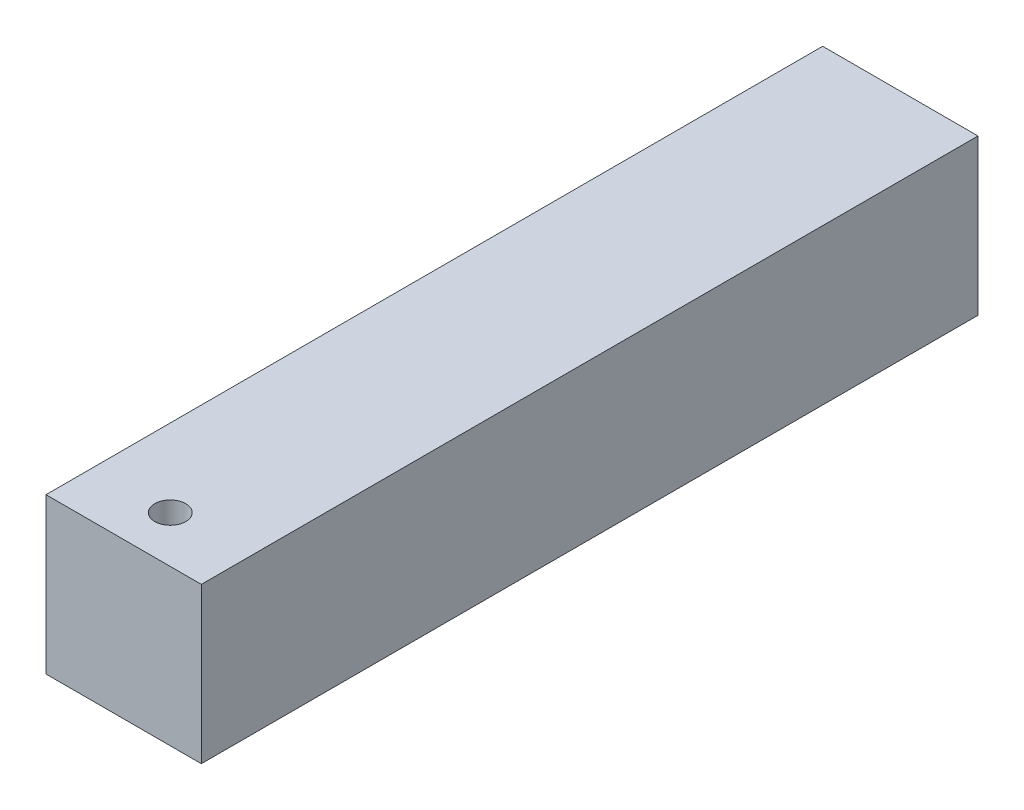
ISO-10303-21;
HEADER;
FILE_DESCRIPTION(('STEP AP214'),'2;1');
FILE_NAME('part.step','',(''),(''),'','','');
FILE_SCHEMA(('AUTOMOTIVE_DESIGN { 1 0 10303 214 1 1 1 1 }'));
ENDSEC;
DATA;
#1=APPLICATION_CONTEXT('core data for automotive mechanical design processes');
#2=APPLICATION_PROTOCOL_DEFINITION('international standard','automotive_design',2000,#1);
#3=PRODUCT_CONTEXT('',#1,'mechanical');
#4=PRODUCT('Part','Part','',(#3));
#5=PRODUCT_RELATED_PRODUCT_CATEGORY('part','',(#4));
#6=PRODUCT_DEFINITION_FORMATION('','',#4);
#7=PRODUCT_DEFINITION_CONTEXT('part definition',#1,'design');
#8=PRODUCT_DEFINITION('design','',#6,#7);
#9=PRODUCT_DEFINITION_SHAPE('','',#8);
#10=(LENGTH_UNIT() NAMED_UNIT(*) SI_UNIT(.MILLI.,.METRE.));
#11=(NAMED_UNIT(*) PLANE_ANGLE_UNIT() SI_UNIT($,.RADIAN.));
#12=(NAMED_UNIT(*) SI_UNIT($,.STERADIAN.) SOLID_ANGLE_UNIT());
#13=UNCERTAINTY_MEASURE_WITH_UNIT(LENGTH_MEASURE(1.E-05),#10,'distance_accuracy_value','');
#14=(GEOMETRIC_REPRESENTATION_CONTEXT(3) GLOBAL_UNCERTAINTY_ASSIGNED_CONTEXT((#13)) GLOBAL_UNIT_ASSIGNED_CONTEXT((#10,
#11,#12)) REPRESENTATION_CONTEXT('',''));
#15=CARTESIAN_POINT('',(0.,0.,0.));
#16=DIRECTION('',(0.,0.,1.));
#17=DIRECTION('',(1.,0.,0.));
#18=AXIS2_PLACEMENT_3D('',#15,#16,#17);
#19=CARTESIAN_POINT('',(0.,0.,50.));
#20=DIRECTION('',(1.,0.,0.));
#21=DIRECTION('',(0.,1.,0.));
#22=AXIS2_PLACEMENT_3D('',#19,#20,#21);
#23=PLANE('',#22);
#24=DIRECTION('',(0.,-1.,0.));
#25=VECTOR('',#24,1.);
#26=CARTESIAN_POINT('',(0.,0.,0.));
#27=LINE('',#26,#25);
#28=CARTESIAN_POINT('',(0.,0.,0.));
#29=VERTEX_POINT('',#28);
#30=CARTESIAN_POINT('',(0.,-10.,0.));
#31=VERTEX_POINT('',#30);
#32=EDGE_CURVE('E109',#29,#31,#27,.T.);
#33=ORIENTED_EDGE('',*,*,#32,.T.);
#34=DIRECTION('',(0.,0.,-1.));
#35=VECTOR('',#34,1.);
#36=CARTESIAN_POINT('',(0.,-10.,50.));
#37=LINE('',#36,#35);
#38=CARTESIAN_POINT('',(0.,-10.,50.));
#39=VERTEX_POINT('',#38);
#40=EDGE_CURVE('E11',#39,#31,#37,.T.);
#41=ORIENTED_EDGE('',*,*,#40,.F.);
#42=DIRECTION('',(0.,-1.,0.));
#43=VECTOR('',#42,1.);
#44=CARTESIAN_POINT('',(0.,0.,50.));
#45=LINE('',#44,#43);
#46=CARTESIAN_POINT('',(0.,0.,50.));
#47=VERTEX_POINT('',#46);
#48=EDGE_CURVE('E92',#47,#39,#45,.T.);
#49=ORIENTED_EDGE('',*,*,#48,.F.);
#50=DIRECTION('',(0.,0.,-1.));
#51=VECTOR('',#50,1.);
#52=CARTESIAN_POINT('',(0.,0.,50.));
#53=LINE('',#52,#51);
#54=EDGE_CURVE('E105',#47,#29,#53,.T.);
#55=ORIENTED_EDGE('',*,*,#54,.T.);
#56=EDGE_LOOP('',(#33,#41,#49,#55));
#57=FACE_BOUND('',#56,.T.);
#58=ADVANCED_FACE('F39',(#57),#23,.F.);
#59=CARTESIAN_POINT('',(0.,-10.,50.));
#60=DIRECTION('',(0.,1.,0.));
#61=DIRECTION('',(0.,0.,1.));
#62=AXIS2_PLACEMENT_3D('',#59,#60,#61);
#63=PLANE('',#62);
#64=CARTESIAN_POINT('',(5.,-10.,47.));
#65=DIRECTION('',(0.,-1.,0.));
#66=DIRECTION('',(0.,0.,-1.));
#67=AXIS2_PLACEMENT_3D('',#64,#65,#66);
#68=CIRCLE('',#67,1.);
#69=CARTESIAN_POINT('',(5.,-10.,46.));
#70=VERTEX_POINT('',#69);
#71=EDGE_CURVE('E129',#70,#70,#68,.T.);
#72=ORIENTED_EDGE('',*,*,#71,.F.);
#73=EDGE_LOOP('',(#72));
#74=FACE_BOUND('',#73,.T.);
#75=DIRECTION('',(1.,0.,0.));
#76=VECTOR('',#75,1.);
#77=CARTESIAN_POINT('',(0.,-10.,0.));
#78=LINE('',#77,#76);
#79=CARTESIAN_POINT('',(10.,-10.,0.));
#80=VERTEX_POINT('',#79);
#81=EDGE_CURVE('E97',#31,#80,#78,.T.);
#82=ORIENTED_EDGE('',*,*,#81,.T.);
#83=DIRECTION('',(0.,0.,-1.));
#84=VECTOR('',#83,1.);
#85=CARTESIAN_POINT('',(10.,-10.,50.));
#86=LINE('',#85,#84);
#87=CARTESIAN_POINT('',(10.,-10.,50.));
#88=VERTEX_POINT('',#87);
#89=EDGE_CURVE('E49',#88,#80,#86,.T.);
#90=ORIENTED_EDGE('',*,*,#89,.F.);
#91=DIRECTION('',(1.,0.,0.));
#92=VECTOR('',#91,1.);
#93=CARTESIAN_POINT('',(0.,-10.,50.));
#94=LINE('',#93,#92);
#95=EDGE_CURVE('E87',#39,#88,#94,.T.);
#96=ORIENTED_EDGE('',*,*,#95,.F.);
#97=ORIENTED_EDGE('',*,*,#40,.T.);
#98=EDGE_LOOP('',(#82,#90,#96,#97));
#99=FACE_BOUND('',#98,.T.);
#100=ADVANCED_FACE('F96',(#74,#99),#63,.F.);
#101=CARTESIAN_POINT('',(10.,0.,50.));
#102=DIRECTION('',(-1.,0.,0.));
#103=DIRECTION('',(0.,-1.,0.));
#104=AXIS2_PLACEMENT_3D('',#101,#102,#103);
#105=PLANE('',#104);
#106=DIRECTION('',(0.,1.,0.));
#107=VECTOR('',#106,1.);
#108=CARTESIAN_POINT('',(10.,0.,0.));
#109=LINE('',#108,#107);
#110=CARTESIAN_POINT('',(10.,0.,0.));
#111=VERTEX_POINT('',#110);
#112=EDGE_CURVE('E74',#80,#111,#109,.T.);
#113=ORIENTED_EDGE('',*,*,#112,.T.);
#114=DIRECTION('',(0.,0.,-1.));
#115=VECTOR('',#114,1.);
#116=CARTESIAN_POINT('',(10.,0.,50.));
#117=LINE('',#116,#115);
#118=CARTESIAN_POINT('',(10.,0.,50.));
#119=VERTEX_POINT('',#118);
#120=EDGE_CURVE('E99',#119,#111,#117,.T.);
#121=ORIENTED_EDGE('',*,*,#120,.F.);
#122=DIRECTION('',(0.,1.,0.));
#123=VECTOR('',#122,1.);
#124=CARTESIAN_POINT('',(10.,0.,50.));
#125=LINE('',#124,#123);
#126=EDGE_CURVE('E90',#88,#119,#125,.T.);
#127=ORIENTED_EDGE('',*,*,#126,.F.);
#128=ORIENTED_EDGE('',*,*,#89,.T.);
#129=EDGE_LOOP('',(#113,#121,#127,#128));
#130=FACE_BOUND('',#129,.T.);
#131=ADVANCED_FACE('F101',(#130),#105,.F.);
#132=CARTESIAN_POINT('',(0.,0.,50.));
#133=DIRECTION('',(0.,-1.,0.));
#134=DIRECTION('',(0.,0.,-1.));
#135=AXIS2_PLACEMENT_3D('',#132,#133,#134);
#136=PLANE('',#135);
#137=CARTESIAN_POINT('',(5.,0.,47.));
#138=DIRECTION('',(0.,-1.,0.));
#139=DIRECTION('',(0.,0.,-1.));
#140=AXIS2_PLACEMENT_3D('',#137,#138,#139);
#141=CIRCLE('',#140,1.);
#142=CARTESIAN_POINT('',(5.,0.,46.));
#143=VERTEX_POINT('',#142);
#144=EDGE_CURVE('E42',#143,#143,#141,.T.);
#145=ORIENTED_EDGE('',*,*,#144,.T.);
#146=EDGE_LOOP('',(#145));
#147=FACE_BOUND('',#146,.T.);
#148=DIRECTION('',(-1.,0.,0.));
#149=VECTOR('',#148,1.);
#150=CARTESIAN_POINT('',(0.,0.,0.));
#151=LINE('',#150,#149);
#152=EDGE_CURVE('E80',#111,#29,#151,.T.);
#153=ORIENTED_EDGE('',*,*,#152,.T.);
#154=ORIENTED_EDGE('',*,*,#54,.F.);
#155=DIRECTION('',(-1.,0.,0.));
#156=VECTOR('',#155,1.);
#157=CARTESIAN_POINT('',(0.,0.,50.));
#158=LINE('',#157,#156);
#159=EDGE_CURVE('E57',#119,#47,#158,.T.);
#160=ORIENTED_EDGE('',*,*,#159,.F.);
#161=ORIENTED_EDGE('',*,*,#120,.T.);
#162=EDGE_LOOP('',(#153,#154,#160,#161));
#163=FACE_BOUND('',#162,.T.);
#164=ADVANCED_FACE('F122',(#147,#163),#136,.F.);
#165=CARTESIAN_POINT('',(0.,0.,50.));
#166=DIRECTION('',(0.,0.,1.));
#167=DIRECTION('',(1.,0.,0.));
#168=AXIS2_PLACEMENT_3D('',#165,#166,#167);
#169=PLANE('',#168);
#170=ORIENTED_EDGE('',*,*,#48,.T.);
#171=ORIENTED_EDGE('',*,*,#95,.T.);
#172=ORIENTED_EDGE('',*,*,#126,.T.);
#173=ORIENTED_EDGE('',*,*,#159,.T.);
#174=EDGE_LOOP('',(#170,#171,#172,#173));
#175=FACE_BOUND('',#174,.T.);
#176=ADVANCED_FACE('F88',(#175),#169,.T.);
#177=CARTESIAN_POINT('',(0.,0.,0.));
#178=DIRECTION('',(0.,0.,1.));
#179=DIRECTION('',(1.,0.,0.));
#180=AXIS2_PLACEMENT_3D('',#177,#178,#179);
#181=PLANE('',#180);
#182=ORIENTED_EDGE('',*,*,#32,.F.);
#183=ORIENTED_EDGE('',*,*,#152,.F.);
#184=ORIENTED_EDGE('',*,*,#112,.F.);
#185=ORIENTED_EDGE('',*,*,#81,.F.);
#186=EDGE_LOOP('',(#182,#183,#184,#185));
#187=FACE_BOUND('',#186,.T.);
#188=ADVANCED_FACE('F125',(#187),#181,.F.);
#189=CARTESIAN_POINT('',(5.,40.,47.));
#190=DIRECTION('',(0.,-1.,0.));
#191=DIRECTION('',(0.,0.,-1.));
#192=AXIS2_PLACEMENT_3D('',#189,#190,#191);
#193=CYLINDRICAL_SURFACE('',#192,1.);
#194=ORIENTED_EDGE('',*,*,#71,.T.);
#195=EDGE_LOOP('',(#194));
#196=FACE_BOUND('',#195,.T.);
#197=ORIENTED_EDGE('',*,*,#144,.F.);
#198=EDGE_LOOP('',(#197));
#199=FACE_BOUND('',#198,.T.);
#200=ADVANCED_FACE('F139',(#196,#199),#193,.F.);
#201=CLOSED_SHELL('',(#58,#100,#131,#164,#176,#188,#200));
#202=MANIFOLD_SOLID_BREP('B2',#201);
#203=ADVANCED_BREP_SHAPE_REPRESENTATION('',(#18,#202),#14);
#204=SHAPE_DEFINITION_REPRESENTATION(#9,#203);
ENDSEC;
END-ISO-10303-21;
